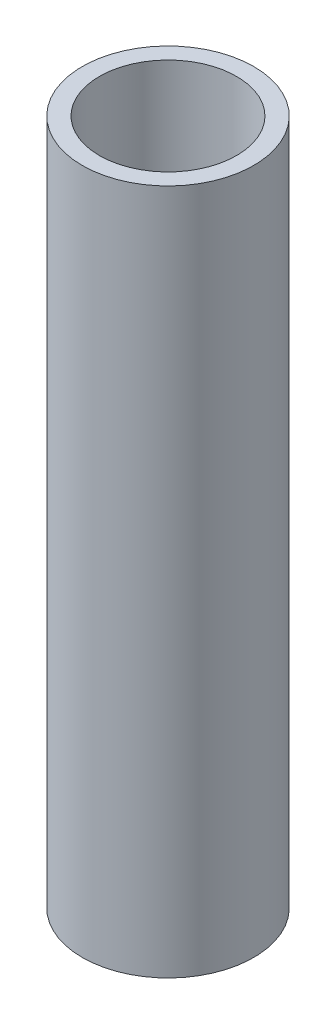
ISO-10303-21;
HEADER;
FILE_DESCRIPTION(('STEP AP214'),'2;1');
FILE_NAME('part.step','',(''),(''),'','','');
FILE_SCHEMA(('AUTOMOTIVE_DESIGN { 1 0 10303 214 1 1 1 1 }'));
ENDSEC;
DATA;
#1=APPLICATION_CONTEXT('core data for automotive mechanical design processes');
#2=APPLICATION_PROTOCOL_DEFINITION('international standard','automotive_design',2000,#1);
#3=PRODUCT_CONTEXT('',#1,'mechanical');
#4=PRODUCT('Part','Part','',(#3));
#5=PRODUCT_RELATED_PRODUCT_CATEGORY('part','',(#4));
#6=PRODUCT_DEFINITION_FORMATION('','',#4);
#7=PRODUCT_DEFINITION_CONTEXT('part definition',#1,'design');
#8=PRODUCT_DEFINITION('design','',#6,#7);
#9=PRODUCT_DEFINITION_SHAPE('','',#8);
#10=(LENGTH_UNIT() NAMED_UNIT(*) SI_UNIT(.MILLI.,.METRE.));
#11=(NAMED_UNIT(*) PLANE_ANGLE_UNIT() SI_UNIT($,.RADIAN.));
#12=(NAMED_UNIT(*) SI_UNIT($,.STERADIAN.) SOLID_ANGLE_UNIT());
#13=UNCERTAINTY_MEASURE_WITH_UNIT(LENGTH_MEASURE(1.E-05),#10,'distance_accuracy_value','');
#14=(GEOMETRIC_REPRESENTATION_CONTEXT(3) GLOBAL_UNCERTAINTY_ASSIGNED_CONTEXT((#13)) GLOBAL_UNIT_ASSIGNED_CONTEXT((#10,
#11,#12)) REPRESENTATION_CONTEXT('',''));
#15=CARTESIAN_POINT('',(0.,0.,0.));
#16=DIRECTION('',(0.,0.,1.));
#17=DIRECTION('',(1.,0.,0.));
#18=AXIS2_PLACEMENT_3D('',#15,#16,#17);
#19=CARTESIAN_POINT('',(0.,100.,0.));
#20=DIRECTION('',(0.,1.,0.));
#21=DIRECTION('',(0.,0.,1.));
#22=AXIS2_PLACEMENT_3D('',#19,#20,#21);
#23=PLANE('',#22);
#24=CARTESIAN_POINT('',(0.,100.,0.));
#25=DIRECTION('',(0.,1.,0.));
#26=DIRECTION('',(0.,0.,1.));
#27=AXIS2_PLACEMENT_3D('',#24,#25,#26);
#28=CIRCLE('',#27,12.5);
#29=CARTESIAN_POINT('',(0.,100.,12.5));
#30=VERTEX_POINT('',#29);
#31=EDGE_CURVE('E10',#30,#30,#28,.T.);
#32=ORIENTED_EDGE('',*,*,#31,.T.);
#33=EDGE_LOOP('',(#32));
#34=FACE_BOUND('',#33,.T.);
#35=CARTESIAN_POINT('',(0.,100.,0.));
#36=DIRECTION('',(0.,1.,0.));
#37=DIRECTION('',(0.,0.,1.));
#38=AXIS2_PLACEMENT_3D('',#35,#36,#37);
#39=CIRCLE('',#38,10.);
#40=CARTESIAN_POINT('',(0.,100.,10.));
#41=VERTEX_POINT('',#40);
#42=EDGE_CURVE('E42',#41,#41,#39,.T.);
#43=ORIENTED_EDGE('',*,*,#42,.F.);
#44=EDGE_LOOP('',(#43));
#45=FACE_BOUND('',#44,.T.);
#46=ADVANCED_FACE('F31',(#34,#45),#23,.T.);
#47=CARTESIAN_POINT('',(0.,0.,0.));
#48=DIRECTION('',(0.,1.,0.));
#49=DIRECTION('',(0.,0.,1.));
#50=AXIS2_PLACEMENT_3D('',#47,#48,#49);
#51=PLANE('',#50);
#52=CARTESIAN_POINT('',(0.,0.,0.));
#53=DIRECTION('',(0.,1.,0.));
#54=DIRECTION('',(0.,0.,1.));
#55=AXIS2_PLACEMENT_3D('',#52,#53,#54);
#56=CIRCLE('',#55,12.5);
#57=CARTESIAN_POINT('',(0.,0.,12.5));
#58=VERTEX_POINT('',#57);
#59=EDGE_CURVE('E35',#58,#58,#56,.T.);
#60=ORIENTED_EDGE('',*,*,#59,.F.);
#61=EDGE_LOOP('',(#60));
#62=FACE_BOUND('',#61,.T.);
#63=CARTESIAN_POINT('',(0.,0.,0.));
#64=DIRECTION('',(0.,1.,0.));
#65=DIRECTION('',(0.,0.,1.));
#66=AXIS2_PLACEMENT_3D('',#63,#64,#65);
#67=CIRCLE('',#66,10.);
#68=CARTESIAN_POINT('',(0.,0.,10.));
#69=VERTEX_POINT('',#68);
#70=EDGE_CURVE('E44',#69,#69,#67,.T.);
#71=ORIENTED_EDGE('',*,*,#70,.T.);
#72=EDGE_LOOP('',(#71));
#73=FACE_BOUND('',#72,.T.);
#74=ADVANCED_FACE('F54',(#62,#73),#51,.F.);
#75=CARTESIAN_POINT('',(0.,100.,0.));
#76=DIRECTION('',(0.,-1.,0.));
#77=DIRECTION('',(0.,0.,-1.));
#78=AXIS2_PLACEMENT_3D('',#75,#76,#77);
#79=CYLINDRICAL_SURFACE('',#78,12.5);
#80=ORIENTED_EDGE('',*,*,#31,.F.);
#81=EDGE_LOOP('',(#80));
#82=FACE_BOUND('',#81,.T.);
#83=ORIENTED_EDGE('',*,*,#59,.T.);
#84=EDGE_LOOP('',(#83));
#85=FACE_BOUND('',#84,.T.);
#86=ADVANCED_FACE('F33',(#82,#85),#79,.T.);
#87=CARTESIAN_POINT('',(0.,100.,0.));
#88=DIRECTION('',(0.,-1.,0.));
#89=DIRECTION('',(0.,0.,-1.));
#90=AXIS2_PLACEMENT_3D('',#87,#88,#89);
#91=CYLINDRICAL_SURFACE('',#90,10.);
#92=ORIENTED_EDGE('',*,*,#42,.T.);
#93=EDGE_LOOP('',(#92));
#94=FACE_BOUND('',#93,.T.);
#95=ORIENTED_EDGE('',*,*,#70,.F.);
#96=EDGE_LOOP('',(#95));
#97=FACE_BOUND('',#96,.T.);
#98=ADVANCED_FACE('F50',(#94,#97),#91,.F.);
#99=CLOSED_SHELL('',(#46,#74,#86,#98));
#100=MANIFOLD_SOLID_BREP('B2',#99);
#101=ADVANCED_BREP_SHAPE_REPRESENTATION('',(#18,#100),#14);
#102=SHAPE_DEFINITION_REPRESENTATION(#9,#101);
ENDSEC;
END-ISO-10303-21;
